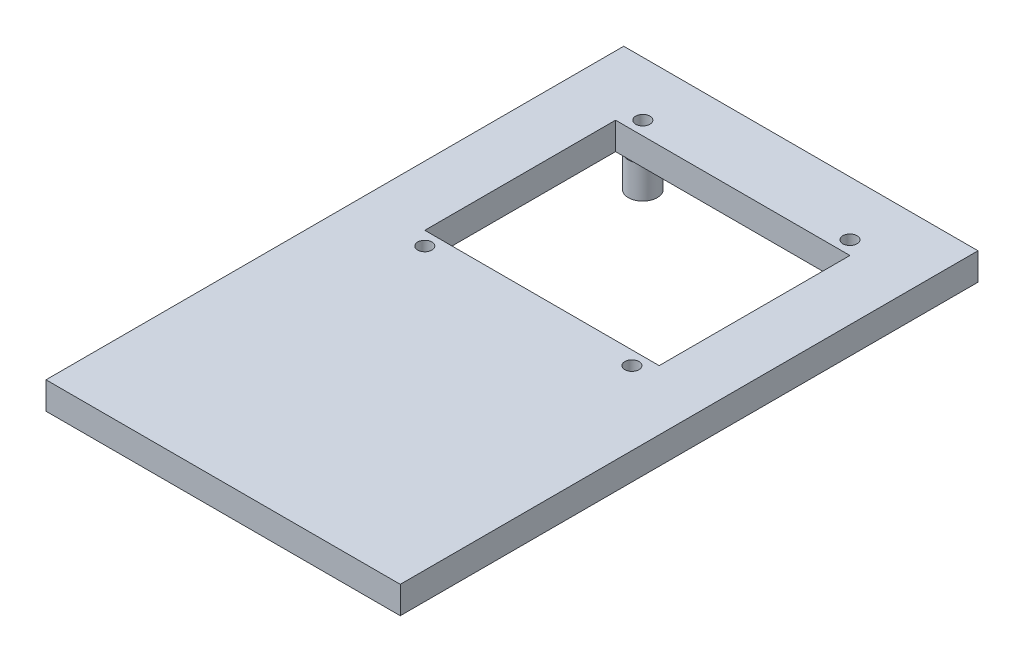
ISO-10303-21;
HEADER;
FILE_DESCRIPTION(('STEP AP214'),'2;1');
FILE_NAME('part.step','',(''),(''),'','','');
FILE_SCHEMA(('AUTOMOTIVE_DESIGN { 1 0 10303 214 1 1 1 1 }'));
ENDSEC;
DATA;
#1=APPLICATION_CONTEXT('core data for automotive mechanical design processes');
#2=APPLICATION_PROTOCOL_DEFINITION('international standard','automotive_design',2000,#1);
#3=PRODUCT_CONTEXT('',#1,'mechanical');
#4=PRODUCT('Part','Part','',(#3));
#5=PRODUCT_RELATED_PRODUCT_CATEGORY('part','',(#4));
#6=PRODUCT_DEFINITION_FORMATION('','',#4);
#7=PRODUCT_DEFINITION_CONTEXT('part definition',#1,'design');
#8=PRODUCT_DEFINITION('design','',#6,#7);
#9=PRODUCT_DEFINITION_SHAPE('','',#8);
#10=(LENGTH_UNIT() NAMED_UNIT(*) SI_UNIT(.MILLI.,.METRE.));
#11=(NAMED_UNIT(*) PLANE_ANGLE_UNIT() SI_UNIT($,.RADIAN.));
#12=(NAMED_UNIT(*) SI_UNIT($,.STERADIAN.) SOLID_ANGLE_UNIT());
#13=UNCERTAINTY_MEASURE_WITH_UNIT(LENGTH_MEASURE(1.E-05),#10,'distance_accuracy_value','');
#14=(GEOMETRIC_REPRESENTATION_CONTEXT(3) GLOBAL_UNCERTAINTY_ASSIGNED_CONTEXT((#13)) GLOBAL_UNIT_ASSIGNED_CONTEXT((#10,
#11,#12)) REPRESENTATION_CONTEXT('',''));
#15=CARTESIAN_POINT('',(0.,0.,0.));
#16=DIRECTION('',(0.,0.,1.));
#17=DIRECTION('',(1.,0.,0.));
#18=AXIS2_PLACEMENT_3D('',#15,#16,#17);
#19=CARTESIAN_POINT('',(-47.,5.,-30.));
#20=DIRECTION('',(0.,0.,-1.));
#21=DIRECTION('',(-1.,0.,0.));
#22=AXIS2_PLACEMENT_3D('',#19,#20,#21);
#23=PLANE('',#22);
#24=DIRECTION('',(1.,0.,0.));
#25=VECTOR('',#24,1.);
#26=CARTESIAN_POINT('',(-47.,0.,-30.));
#27=LINE('',#26,#25);
#28=CARTESIAN_POINT('',(-47.,0.,-30.));
#29=VERTEX_POINT('',#28);
#30=CARTESIAN_POINT('',(18.,0.,-30.));
#31=VERTEX_POINT('',#30);
#32=EDGE_CURVE('E275',#29,#31,#27,.T.);
#33=ORIENTED_EDGE('',*,*,#32,.F.);
#34=DIRECTION('',(0.,-1.,0.));
#35=VECTOR('',#34,1.);
#36=CARTESIAN_POINT('',(-47.,5.,-30.));
#37=LINE('',#36,#35);
#38=CARTESIAN_POINT('',(-47.,5.,-30.));
#39=VERTEX_POINT('',#38);
#40=EDGE_CURVE('E11',#39,#29,#37,.T.);
#41=ORIENTED_EDGE('',*,*,#40,.F.);
#42=DIRECTION('',(1.,0.,0.));
#43=VECTOR('',#42,1.);
#44=CARTESIAN_POINT('',(-47.,5.,-30.));
#45=LINE('',#44,#43);
#46=CARTESIAN_POINT('',(18.,5.,-30.));
#47=VERTEX_POINT('',#46);
#48=EDGE_CURVE('E138',#39,#47,#45,.T.);
#49=ORIENTED_EDGE('',*,*,#48,.T.);
#50=DIRECTION('',(0.,-1.,0.));
#51=VECTOR('',#50,1.);
#52=CARTESIAN_POINT('',(18.,5.,-30.));
#53=LINE('',#52,#51);
#54=EDGE_CURVE('E44',#47,#31,#53,.T.);
#55=ORIENTED_EDGE('',*,*,#54,.T.);
#56=EDGE_LOOP('',(#33,#41,#49,#55));
#57=FACE_BOUND('',#56,.T.);
#58=ADVANCED_FACE('F41',(#57),#23,.T.);
#59=CARTESIAN_POINT('',(-47.,5.,-30.));
#60=DIRECTION('',(1.,0.,0.));
#61=DIRECTION('',(0.,0.,-1.));
#62=AXIS2_PLACEMENT_3D('',#59,#60,#61);
#63=PLANE('',#62);
#64=DIRECTION('',(0.,0.,1.));
#65=VECTOR('',#64,1.);
#66=CARTESIAN_POINT('',(-47.,0.,-30.));
#67=LINE('',#66,#65);
#68=CARTESIAN_POINT('',(-47.,0.,76.));
#69=VERTEX_POINT('',#68);
#70=EDGE_CURVE('E129',#29,#69,#67,.T.);
#71=ORIENTED_EDGE('',*,*,#70,.T.);
#72=DIRECTION('',(0.,-1.,0.));
#73=VECTOR('',#72,1.);
#74=CARTESIAN_POINT('',(-47.,5.,76.));
#75=LINE('',#74,#73);
#76=CARTESIAN_POINT('',(-47.,5.,76.));
#77=VERTEX_POINT('',#76);
#78=EDGE_CURVE('E134',#77,#69,#75,.T.);
#79=ORIENTED_EDGE('',*,*,#78,.F.);
#80=DIRECTION('',(0.,0.,1.));
#81=VECTOR('',#80,1.);
#82=CARTESIAN_POINT('',(-47.,5.,-30.));
#83=LINE('',#82,#81);
#84=EDGE_CURVE('E280',#39,#77,#83,.T.);
#85=ORIENTED_EDGE('',*,*,#84,.F.);
#86=ORIENTED_EDGE('',*,*,#40,.T.);
#87=EDGE_LOOP('',(#71,#79,#85,#86));
#88=FACE_BOUND('',#87,.T.);
#89=ADVANCED_FACE('F131',(#88),#63,.F.);
#90=CARTESIAN_POINT('',(18.,5.,-30.));
#91=DIRECTION('',(1.,0.,0.));
#92=DIRECTION('',(0.,0.,-1.));
#93=AXIS2_PLACEMENT_3D('',#90,#91,#92);
#94=PLANE('',#93);
#95=DIRECTION('',(0.,0.,1.));
#96=VECTOR('',#95,1.);
#97=CARTESIAN_POINT('',(18.,0.,-30.));
#98=LINE('',#97,#96);
#99=CARTESIAN_POINT('',(18.,0.,76.));
#100=VERTEX_POINT('',#99);
#101=EDGE_CURVE('E139',#31,#100,#98,.T.);
#102=ORIENTED_EDGE('',*,*,#101,.F.);
#103=ORIENTED_EDGE('',*,*,#54,.F.);
#104=DIRECTION('',(0.,0.,1.));
#105=VECTOR('',#104,1.);
#106=CARTESIAN_POINT('',(18.,5.,-30.));
#107=LINE('',#106,#105);
#108=CARTESIAN_POINT('',(18.,5.,76.));
#109=VERTEX_POINT('',#108);
#110=EDGE_CURVE('E278',#47,#109,#107,.T.);
#111=ORIENTED_EDGE('',*,*,#110,.T.);
#112=DIRECTION('',(0.,1.,0.));
#113=VECTOR('',#112,1.);
#114=CARTESIAN_POINT('',(18.,0.,76.));
#115=LINE('',#114,#113);
#116=EDGE_CURVE('E148',#100,#109,#115,.T.);
#117=ORIENTED_EDGE('',*,*,#116,.F.);
#118=EDGE_LOOP('',(#102,#103,#111,#117));
#119=FACE_BOUND('',#118,.T.);
#120=ADVANCED_FACE('F287',(#119),#94,.T.);
#121=CARTESIAN_POINT('',(0.,5.,0.));
#122=DIRECTION('',(0.,-1.,0.));
#123=DIRECTION('',(0.,0.,-1.));
#124=AXIS2_PLACEMENT_3D('',#121,#122,#123);
#125=PLANE('',#124);
#126=CARTESIAN_POINT('',(-33.5,5.,20.));
#127=DIRECTION('',(0.,1.,0.));
#128=DIRECTION('',(0.,0.,1.));
#129=AXIS2_PLACEMENT_3D('',#126,#127,#128);
#130=CIRCLE('',#129,1.29999999999999);
#131=CARTESIAN_POINT('',(-33.5,5.,21.3));
#132=VERTEX_POINT('',#131);
#133=EDGE_CURVE('E209',#132,#132,#130,.T.);
#134=ORIENTED_EDGE('',*,*,#133,.F.);
#135=EDGE_LOOP('',(#134));
#136=FACE_BOUND('',#135,.T.);
#137=CARTESIAN_POINT('',(4.50000000000001,5.,20.));
#138=DIRECTION('',(0.,1.,0.));
#139=DIRECTION('',(0.,0.,1.));
#140=AXIS2_PLACEMENT_3D('',#137,#138,#139);
#141=CIRCLE('',#140,1.3);
#142=CARTESIAN_POINT('',(4.50000000000001,5.,21.3));
#143=VERTEX_POINT('',#142);
#144=EDGE_CURVE('E223',#143,#143,#141,.T.);
#145=ORIENTED_EDGE('',*,*,#144,.F.);
#146=EDGE_LOOP('',(#145));
#147=FACE_BOUND('',#146,.T.);
#148=CARTESIAN_POINT('',(4.49999999999999,5.,-20.));
#149=DIRECTION('',(0.,1.,0.));
#150=DIRECTION('',(0.,0.,1.));
#151=AXIS2_PLACEMENT_3D('',#148,#149,#150);
#152=CIRCLE('',#151,1.3);
#153=CARTESIAN_POINT('',(4.49999999999999,5.,-18.7));
#154=VERTEX_POINT('',#153);
#155=EDGE_CURVE('E217',#154,#154,#152,.T.);
#156=ORIENTED_EDGE('',*,*,#155,.F.);
#157=EDGE_LOOP('',(#156));
#158=FACE_BOUND('',#157,.T.);
#159=CARTESIAN_POINT('',(-33.5,5.,-20.));
#160=DIRECTION('',(0.,1.,0.));
#161=DIRECTION('',(0.,0.,1.));
#162=AXIS2_PLACEMENT_3D('',#159,#160,#161);
#163=CIRCLE('',#162,1.29999999999999);
#164=CARTESIAN_POINT('',(-33.5,5.,-18.7));
#165=VERTEX_POINT('',#164);
#166=EDGE_CURVE('E231',#165,#165,#163,.T.);
#167=ORIENTED_EDGE('',*,*,#166,.F.);
#168=EDGE_LOOP('',(#167));
#169=FACE_BOUND('',#168,.T.);
#170=DIRECTION('',(-1.,0.,0.));
#171=VECTOR('',#170,1.);
#172=CARTESIAN_POINT('',(0.,5.,17.5));
#173=LINE('',#172,#171);
#174=CARTESIAN_POINT('',(7.00000000000001,5.,17.5));
#175=VERTEX_POINT('',#174);
#176=CARTESIAN_POINT('',(-36.,5.,17.5));
#177=VERTEX_POINT('',#176);
#178=EDGE_CURVE('E269',#175,#177,#173,.T.);
#179=ORIENTED_EDGE('',*,*,#178,.T.);
#180=DIRECTION('',(0.,0.,-1.));
#181=VECTOR('',#180,1.);
#182=CARTESIAN_POINT('',(-36.,5.,0.));
#183=LINE('',#182,#181);
#184=CARTESIAN_POINT('',(-36.,5.,-17.5));
#185=VERTEX_POINT('',#184);
#186=EDGE_CURVE('E272',#177,#185,#183,.T.);
#187=ORIENTED_EDGE('',*,*,#186,.T.);
#188=DIRECTION('',(1.,0.,0.));
#189=VECTOR('',#188,1.);
#190=CARTESIAN_POINT('',(0.,5.,-17.5));
#191=LINE('',#190,#189);
#192=CARTESIAN_POINT('',(7.00000000000001,5.,-17.5));
#193=VERTEX_POINT('',#192);
#194=EDGE_CURVE('E256',#185,#193,#191,.T.);
#195=ORIENTED_EDGE('',*,*,#194,.T.);
#196=DIRECTION('',(0.,0.,1.));
#197=VECTOR('',#196,1.);
#198=CARTESIAN_POINT('',(7.00000000000001,5.,0.));
#199=LINE('',#198,#197);
#200=EDGE_CURVE('E266',#193,#175,#199,.T.);
#201=ORIENTED_EDGE('',*,*,#200,.T.);
#202=EDGE_LOOP('',(#179,#187,#195,#201));
#203=FACE_BOUND('',#202,.T.);
#204=ORIENTED_EDGE('',*,*,#48,.F.);
#205=ORIENTED_EDGE('',*,*,#84,.T.);
#206=DIRECTION('',(-1.,0.,0.));
#207=VECTOR('',#206,1.);
#208=CARTESIAN_POINT('',(18.,5.,76.));
#209=LINE('',#208,#207);
#210=EDGE_CURVE('E153',#109,#77,#209,.T.);
#211=ORIENTED_EDGE('',*,*,#210,.F.);
#212=ORIENTED_EDGE('',*,*,#110,.F.);
#213=EDGE_LOOP('',(#204,#205,#211,#212));
#214=FACE_BOUND('',#213,.T.);
#215=ADVANCED_FACE('F289',(#136,#147,#158,#169,#203,#214),#125,.F.);
#216=CARTESIAN_POINT('',(0.,0.,0.));
#217=DIRECTION('',(0.,-1.,0.));
#218=DIRECTION('',(0.,0.,-1.));
#219=AXIS2_PLACEMENT_3D('',#216,#217,#218);
#220=PLANE('',#219);
#221=DIRECTION('',(1.,0.,0.));
#222=VECTOR('',#221,1.);
#223=CARTESIAN_POINT('',(-36.,0.,-17.5));
#224=LINE('',#223,#222);
#225=CARTESIAN_POINT('',(5.3789197915623,0.,-17.5));
#226=VERTEX_POINT('',#225);
#227=CARTESIAN_POINT('',(7.00000000000001,0.,-17.5));
#228=VERTEX_POINT('',#227);
#229=EDGE_CURVE('E238',#226,#228,#224,.T.);
#230=ORIENTED_EDGE('',*,*,#229,.F.);
#231=CARTESIAN_POINT('',(4.49999999999999,0.,-20.));
#232=DIRECTION('',(0.,-1.,0.));
#233=DIRECTION('',(0.,0.,-1.));
#234=AXIS2_PLACEMENT_3D('',#231,#232,#233);
#235=CIRCLE('',#234,2.65);
#236=CARTESIAN_POINT('',(3.62108020843768,0.,-17.5));
#237=VERTEX_POINT('',#236);
#238=EDGE_CURVE('E161',#237,#226,#235,.T.);
#239=ORIENTED_EDGE('',*,*,#238,.F.);
#240=CARTESIAN_POINT('',(-32.6210802084376,0.,-17.5));
#241=VERTEX_POINT('',#240);
#242=EDGE_CURVE('E243',#241,#237,#224,.T.);
#243=ORIENTED_EDGE('',*,*,#242,.F.);
#244=CARTESIAN_POINT('',(-33.5,0.,-20.));
#245=DIRECTION('',(0.,-1.,0.));
#246=DIRECTION('',(0.,0.,-1.));
#247=AXIS2_PLACEMENT_3D('',#244,#245,#246);
#248=CIRCLE('',#247,2.65000000000001);
#249=CARTESIAN_POINT('',(-34.3789197915624,0.,-17.5));
#250=VERTEX_POINT('',#249);
#251=EDGE_CURVE('E189',#250,#241,#248,.T.);
#252=ORIENTED_EDGE('',*,*,#251,.F.);
#253=CARTESIAN_POINT('',(-36.,0.,-17.5));
#254=VERTEX_POINT('',#253);
#255=EDGE_CURVE('E239',#254,#250,#224,.T.);
#256=ORIENTED_EDGE('',*,*,#255,.F.);
#257=DIRECTION('',(0.,0.,-1.));
#258=VECTOR('',#257,1.);
#259=CARTESIAN_POINT('',(-36.,0.,17.5));
#260=LINE('',#259,#258);
#261=CARTESIAN_POINT('',(-36.,0.,17.5));
#262=VERTEX_POINT('',#261);
#263=EDGE_CURVE('E234',#262,#254,#260,.T.);
#264=ORIENTED_EDGE('',*,*,#263,.F.);
#265=DIRECTION('',(-1.,0.,0.));
#266=VECTOR('',#265,1.);
#267=CARTESIAN_POINT('',(-36.,0.,17.5));
#268=LINE('',#267,#266);
#269=CARTESIAN_POINT('',(-34.3789197915623,0.,17.5));
#270=VERTEX_POINT('',#269);
#271=EDGE_CURVE('E246',#270,#262,#268,.T.);
#272=ORIENTED_EDGE('',*,*,#271,.F.);
#273=CARTESIAN_POINT('',(-33.5,0.,20.));
#274=DIRECTION('',(0.,-1.,0.));
#275=DIRECTION('',(0.,0.,-1.));
#276=AXIS2_PLACEMENT_3D('',#273,#274,#275);
#277=CIRCLE('',#276,2.65);
#278=CARTESIAN_POINT('',(-32.6210802084377,0.,17.5));
#279=VERTEX_POINT('',#278);
#280=EDGE_CURVE('E210',#279,#270,#277,.T.);
#281=ORIENTED_EDGE('',*,*,#280,.F.);
#282=CARTESIAN_POINT('',(3.62108020843765,0.,17.5));
#283=VERTEX_POINT('',#282);
#284=EDGE_CURVE('E251',#283,#279,#268,.T.);
#285=ORIENTED_EDGE('',*,*,#284,.F.);
#286=CARTESIAN_POINT('',(4.50000000000001,0.,20.));
#287=DIRECTION('',(0.,-1.,0.));
#288=DIRECTION('',(0.,0.,-1.));
#289=AXIS2_PLACEMENT_3D('',#286,#287,#288);
#290=CIRCLE('',#289,2.65);
#291=CARTESIAN_POINT('',(5.37891979156238,0.,17.5));
#292=VERTEX_POINT('',#291);
#293=EDGE_CURVE('E61',#292,#283,#290,.T.);
#294=ORIENTED_EDGE('',*,*,#293,.F.);
#295=CARTESIAN_POINT('',(7.00000000000001,0.,17.5));
#296=VERTEX_POINT('',#295);
#297=EDGE_CURVE('E247',#296,#292,#268,.T.);
#298=ORIENTED_EDGE('',*,*,#297,.F.);
#299=DIRECTION('',(0.,0.,1.));
#300=VECTOR('',#299,1.);
#301=CARTESIAN_POINT('',(7.00000000000001,0.,17.5));
#302=LINE('',#301,#300);
#303=EDGE_CURVE('E242',#228,#296,#302,.T.);
#304=ORIENTED_EDGE('',*,*,#303,.F.);
#305=EDGE_LOOP('',(#230,#239,#243,#252,#256,#264,#272,#281,#285,#294,#298,#304));
#306=FACE_BOUND('',#305,.T.);
#307=ORIENTED_EDGE('',*,*,#32,.T.);
#308=ORIENTED_EDGE('',*,*,#101,.T.);
#309=DIRECTION('',(1.,0.,0.));
#310=VECTOR('',#309,1.);
#311=CARTESIAN_POINT('',(-47.,0.,76.));
#312=LINE('',#311,#310);
#313=EDGE_CURVE('E142',#69,#100,#312,.T.);
#314=ORIENTED_EDGE('',*,*,#313,.F.);
#315=ORIENTED_EDGE('',*,*,#70,.F.);
#316=EDGE_LOOP('',(#307,#308,#314,#315));
#317=FACE_BOUND('',#316,.T.);
#318=ADVANCED_FACE('F143',(#306,#317),#220,.T.);
#319=CARTESIAN_POINT('',(-36.,10.,17.5));
#320=DIRECTION('',(-1.,0.,0.));
#321=DIRECTION('',(0.,0.,1.));
#322=AXIS2_PLACEMENT_3D('',#319,#320,#321);
#323=PLANE('',#322);
#324=DIRECTION('',(0.,-1.,0.));
#325=VECTOR('',#324,1.);
#326=CARTESIAN_POINT('',(-36.,10.,17.5));
#327=LINE('',#326,#325);
#328=EDGE_CURVE('E253',#177,#262,#327,.T.);
#329=ORIENTED_EDGE('',*,*,#328,.T.);
#330=ORIENTED_EDGE('',*,*,#263,.T.);
#331=DIRECTION('',(0.,-1.,0.));
#332=VECTOR('',#331,1.);
#333=CARTESIAN_POINT('',(-36.,10.,-17.5));
#334=LINE('',#333,#332);
#335=EDGE_CURVE('E250',#185,#254,#334,.T.);
#336=ORIENTED_EDGE('',*,*,#335,.F.);
#337=ORIENTED_EDGE('',*,*,#186,.F.);
#338=EDGE_LOOP('',(#329,#330,#336,#337));
#339=FACE_BOUND('',#338,.T.);
#340=ADVANCED_FACE('F297',(#339),#323,.F.);
#341=CARTESIAN_POINT('',(-36.,10.,17.5));
#342=DIRECTION('',(0.,0.,1.));
#343=DIRECTION('',(1.,0.,0.));
#344=AXIS2_PLACEMENT_3D('',#341,#342,#343);
#345=PLANE('',#344);
#346=DIRECTION('',(0.,-1.,0.));
#347=VECTOR('',#346,1.);
#348=CARTESIAN_POINT('',(7.00000000000001,10.,17.5));
#349=LINE('',#348,#347);
#350=EDGE_CURVE('E257',#175,#296,#349,.T.);
#351=ORIENTED_EDGE('',*,*,#350,.T.);
#352=ORIENTED_EDGE('',*,*,#297,.T.);
#353=DIRECTION('',(1.,0.,0.));
#354=VECTOR('',#353,1.);
#355=CARTESIAN_POINT('',(-36.,0.,17.5));
#356=LINE('',#355,#354);
#357=EDGE_CURVE('E180',#283,#292,#356,.T.);
#358=ORIENTED_EDGE('',*,*,#357,.F.);
#359=ORIENTED_EDGE('',*,*,#284,.T.);
#360=EDGE_CURVE('E252',#279,#270,#268,.T.);
#361=ORIENTED_EDGE('',*,*,#360,.T.);
#362=ORIENTED_EDGE('',*,*,#271,.T.);
#363=ORIENTED_EDGE('',*,*,#328,.F.);
#364=ORIENTED_EDGE('',*,*,#178,.F.);
#365=EDGE_LOOP('',(#351,#352,#358,#359,#361,#362,#363,#364));
#366=FACE_BOUND('',#365,.T.);
#367=ADVANCED_FACE('F572',(#366),#345,.F.);
#368=CARTESIAN_POINT('',(7.00000000000001,10.,17.5));
#369=DIRECTION('',(1.,0.,0.));
#370=DIRECTION('',(0.,0.,-1.));
#371=AXIS2_PLACEMENT_3D('',#368,#369,#370);
#372=PLANE('',#371);
#373=DIRECTION('',(0.,-1.,0.));
#374=VECTOR('',#373,1.);
#375=CARTESIAN_POINT('',(7.00000000000001,10.,-17.5));
#376=LINE('',#375,#374);
#377=EDGE_CURVE('E259',#193,#228,#376,.T.);
#378=ORIENTED_EDGE('',*,*,#377,.T.);
#379=ORIENTED_EDGE('',*,*,#303,.T.);
#380=ORIENTED_EDGE('',*,*,#350,.F.);
#381=ORIENTED_EDGE('',*,*,#200,.F.);
#382=EDGE_LOOP('',(#378,#379,#380,#381));
#383=FACE_BOUND('',#382,.T.);
#384=ADVANCED_FACE('F563',(#383),#372,.F.);
#385=CARTESIAN_POINT('',(-36.,10.,-17.5));
#386=DIRECTION('',(0.,0.,-1.));
#387=DIRECTION('',(-1.,0.,0.));
#388=AXIS2_PLACEMENT_3D('',#385,#386,#387);
#389=PLANE('',#388);
#390=ORIENTED_EDGE('',*,*,#335,.T.);
#391=ORIENTED_EDGE('',*,*,#255,.T.);
#392=DIRECTION('',(-1.,0.,0.));
#393=VECTOR('',#392,1.);
#394=CARTESIAN_POINT('',(-36.,0.,-17.5));
#395=LINE('',#394,#393);
#396=EDGE_CURVE('E195',#241,#250,#395,.T.);
#397=ORIENTED_EDGE('',*,*,#396,.F.);
#398=ORIENTED_EDGE('',*,*,#242,.T.);
#399=DIRECTION('',(-1.,0.,0.));
#400=VECTOR('',#399,1.);
#401=CARTESIAN_POINT('',(-36.,0.,-17.5));
#402=LINE('',#401,#400);
#403=EDGE_CURVE('E167',#226,#237,#402,.T.);
#404=ORIENTED_EDGE('',*,*,#403,.F.);
#405=ORIENTED_EDGE('',*,*,#229,.T.);
#406=ORIENTED_EDGE('',*,*,#377,.F.);
#407=ORIENTED_EDGE('',*,*,#194,.F.);
#408=EDGE_LOOP('',(#390,#391,#397,#398,#404,#405,#406,#407));
#409=FACE_BOUND('',#408,.T.);
#410=ADVANCED_FACE('F554',(#409),#389,.F.);
#411=CARTESIAN_POINT('',(-33.5,-0.00100000000000013,-20.));
#412=DIRECTION('',(0.,1.,0.));
#413=DIRECTION('',(0.,0.,1.));
#414=AXIS2_PLACEMENT_3D('',#411,#412,#413);
#415=CYLINDRICAL_SURFACE('',#414,1.29999999999999);
#416=CARTESIAN_POINT('',(-33.5,0.,-20.));
#417=DIRECTION('',(0.,-1.,0.));
#418=DIRECTION('',(0.,0.,-1.));
#419=AXIS2_PLACEMENT_3D('',#416,#417,#418);
#420=CIRCLE('',#419,1.29999999999999);
#421=CARTESIAN_POINT('',(-33.5,0.,-21.3));
#422=VERTEX_POINT('',#421);
#423=EDGE_CURVE('E216',#422,#422,#420,.F.);
#424=ORIENTED_EDGE('',*,*,#423,.F.);
#425=EDGE_LOOP('',(#424));
#426=FACE_BOUND('',#425,.T.);
#427=ORIENTED_EDGE('',*,*,#166,.T.);
#428=EDGE_LOOP('',(#427));
#429=FACE_BOUND('',#428,.T.);
#430=ADVANCED_FACE('F545',(#426,#429),#415,.F.);
#431=CARTESIAN_POINT('',(4.49999999999999,-0.00100000000000013,-20.));
#432=DIRECTION('',(0.,1.,0.));
#433=DIRECTION('',(0.,0.,1.));
#434=AXIS2_PLACEMENT_3D('',#431,#432,#433);
#435=CYLINDRICAL_SURFACE('',#434,1.3);
#436=CARTESIAN_POINT('',(4.49999999999999,0.,-20.));
#437=DIRECTION('',(0.,-1.,0.));
#438=DIRECTION('',(0.,0.,-1.));
#439=AXIS2_PLACEMENT_3D('',#436,#437,#438);
#440=CIRCLE('',#439,1.3);
#441=CARTESIAN_POINT('',(4.49999999999999,0.,-21.3));
#442=VERTEX_POINT('',#441);
#443=EDGE_CURVE('E213',#442,#442,#440,.F.);
#444=ORIENTED_EDGE('',*,*,#443,.F.);
#445=EDGE_LOOP('',(#444));
#446=FACE_BOUND('',#445,.T.);
#447=ORIENTED_EDGE('',*,*,#155,.T.);
#448=EDGE_LOOP('',(#447));
#449=FACE_BOUND('',#448,.T.);
#450=ADVANCED_FACE('F536',(#446,#449),#435,.F.);
#451=CARTESIAN_POINT('',(4.50000000000001,-0.00100000000000013,20.));
#452=DIRECTION('',(0.,1.,0.));
#453=DIRECTION('',(0.,0.,1.));
#454=AXIS2_PLACEMENT_3D('',#451,#452,#453);
#455=CYLINDRICAL_SURFACE('',#454,1.3);
#456=CARTESIAN_POINT('',(4.50000000000001,0.,20.));
#457=DIRECTION('',(0.,-1.,0.));
#458=DIRECTION('',(0.,0.,-1.));
#459=AXIS2_PLACEMENT_3D('',#456,#457,#458);
#460=CIRCLE('',#459,1.3);
#461=CARTESIAN_POINT('',(4.50000000000001,0.,18.7));
#462=VERTEX_POINT('',#461);
#463=EDGE_CURVE('E220',#462,#462,#460,.F.);
#464=ORIENTED_EDGE('',*,*,#463,.F.);
#465=EDGE_LOOP('',(#464));
#466=FACE_BOUND('',#465,.T.);
#467=ORIENTED_EDGE('',*,*,#144,.T.);
#468=EDGE_LOOP('',(#467));
#469=FACE_BOUND('',#468,.T.);
#470=ADVANCED_FACE('F527',(#466,#469),#455,.F.);
#471=CARTESIAN_POINT('',(-33.5,-0.00100000000000013,20.));
#472=DIRECTION('',(0.,1.,0.));
#473=DIRECTION('',(0.,0.,1.));
#474=AXIS2_PLACEMENT_3D('',#471,#472,#473);
#475=CYLINDRICAL_SURFACE('',#474,1.29999999999999);
#476=CARTESIAN_POINT('',(-33.5,0.,20.));
#477=DIRECTION('',(0.,-1.,0.));
#478=DIRECTION('',(0.,0.,-1.));
#479=AXIS2_PLACEMENT_3D('',#476,#477,#478);
#480=CIRCLE('',#479,1.29999999999999);
#481=CARTESIAN_POINT('',(-33.5,0.,18.7));
#482=VERTEX_POINT('',#481);
#483=EDGE_CURVE('E226',#482,#482,#480,.F.);
#484=ORIENTED_EDGE('',*,*,#483,.F.);
#485=EDGE_LOOP('',(#484));
#486=FACE_BOUND('',#485,.T.);
#487=ORIENTED_EDGE('',*,*,#133,.T.);
#488=EDGE_LOOP('',(#487));
#489=FACE_BOUND('',#488,.T.);
#490=ADVANCED_FACE('F519',(#486,#489),#475,.F.);
#491=CARTESIAN_POINT('',(-33.5,0.,20.));
#492=DIRECTION('',(0.,-1.,0.));
#493=DIRECTION('',(0.,0.,-1.));
#494=AXIS2_PLACEMENT_3D('',#491,#492,#493);
#495=PLANE('',#494);
#496=CARTESIAN_POINT('',(-33.5,0.,20.));
#497=DIRECTION('',(0.,-1.,0.));
#498=DIRECTION('',(0.,0.,-1.));
#499=AXIS2_PLACEMENT_3D('',#496,#497,#498);
#500=CIRCLE('',#499,1.04999999999999);
#501=CARTESIAN_POINT('',(-33.5,0.,18.95));
#502=VERTEX_POINT('',#501);
#503=EDGE_CURVE('E199',#502,#502,#500,.T.);
#504=ORIENTED_EDGE('',*,*,#503,.T.);
#505=EDGE_LOOP('',(#504));
#506=FACE_BOUND('',#505,.T.);
#507=ORIENTED_EDGE('',*,*,#483,.T.);
#508=EDGE_LOOP('',(#507));
#509=FACE_BOUND('',#508,.T.);
#510=ADVANCED_FACE('F504',(#506,#509),#495,.F.);
#511=CARTESIAN_POINT('',(-33.5,-6.,20.));
#512=DIRECTION('',(0.,-1.,0.));
#513=DIRECTION('',(0.,0.,-1.));
#514=AXIS2_PLACEMENT_3D('',#511,#512,#513);
#515=PLANE('',#514);
#516=CARTESIAN_POINT('',(-33.5,-6.,20.));
#517=DIRECTION('',(0.,-1.,0.));
#518=DIRECTION('',(0.,0.,-1.));
#519=AXIS2_PLACEMENT_3D('',#516,#517,#518);
#520=CIRCLE('',#519,2.65);
#521=CARTESIAN_POINT('',(-33.5,-6.,17.35));
#522=VERTEX_POINT('',#521);
#523=EDGE_CURVE('E206',#522,#522,#520,.T.);
#524=ORIENTED_EDGE('',*,*,#523,.T.);
#525=EDGE_LOOP('',(#524));
#526=FACE_BOUND('',#525,.T.);
#527=CARTESIAN_POINT('',(-33.5,-6.,20.));
#528=DIRECTION('',(0.,-1.,0.));
#529=DIRECTION('',(0.,0.,-1.));
#530=AXIS2_PLACEMENT_3D('',#527,#528,#529);
#531=CIRCLE('',#530,1.04999999999999);
#532=CARTESIAN_POINT('',(-33.5,-6.,18.95));
#533=VERTEX_POINT('',#532);
#534=EDGE_CURVE('E200',#533,#533,#531,.T.);
#535=ORIENTED_EDGE('',*,*,#534,.F.);
#536=EDGE_LOOP('',(#535));
#537=FACE_BOUND('',#536,.T.);
#538=ADVANCED_FACE('F501',(#526,#537),#515,.T.);
#539=ORIENTED_EDGE('',*,*,#360,.F.);
#540=EDGE_CURVE('E203',#270,#279,#277,.T.);
#541=ORIENTED_EDGE('',*,*,#540,.F.);
#542=EDGE_LOOP('',(#539,#541));
#543=FACE_BOUND('',#542,.T.);
#544=ADVANCED_FACE('F492',(#543),#495,.F.);
#545=CARTESIAN_POINT('',(-33.5,-6.,20.));
#546=DIRECTION('',(0.,1.,0.));
#547=DIRECTION('',(0.,0.,1.));
#548=AXIS2_PLACEMENT_3D('',#545,#546,#547);
#549=CYLINDRICAL_SURFACE('',#548,2.65);
#550=ORIENTED_EDGE('',*,*,#523,.F.);
#551=EDGE_LOOP('',(#550));
#552=FACE_BOUND('',#551,.T.);
#553=ORIENTED_EDGE('',*,*,#280,.T.);
#554=ORIENTED_EDGE('',*,*,#540,.T.);
#555=EDGE_LOOP('',(#553,#554));
#556=FACE_BOUND('',#555,.T.);
#557=ADVANCED_FACE('F483',(#552,#556),#549,.T.);
#558=CARTESIAN_POINT('',(-33.5,-6.,20.));
#559=DIRECTION('',(0.,1.,0.));
#560=DIRECTION('',(0.,0.,1.));
#561=AXIS2_PLACEMENT_3D('',#558,#559,#560);
#562=CYLINDRICAL_SURFACE('',#561,1.04999999999999);
#563=ORIENTED_EDGE('',*,*,#534,.T.);
#564=EDGE_LOOP('',(#563));
#565=FACE_BOUND('',#564,.T.);
#566=ORIENTED_EDGE('',*,*,#503,.F.);
#567=EDGE_LOOP('',(#566));
#568=FACE_BOUND('',#567,.T.);
#569=ADVANCED_FACE('F475',(#565,#568),#562,.F.);
#570=CARTESIAN_POINT('',(-33.5,0.,-20.));
#571=DIRECTION('',(0.,-1.,0.));
#572=DIRECTION('',(0.,0.,-1.));
#573=AXIS2_PLACEMENT_3D('',#570,#571,#572);
#574=PLANE('',#573);
#575=EDGE_CURVE('E185',#241,#250,#248,.T.);
#576=ORIENTED_EDGE('',*,*,#575,.F.);
#577=ORIENTED_EDGE('',*,*,#396,.T.);
#578=EDGE_LOOP('',(#576,#577));
#579=FACE_BOUND('',#578,.T.);
#580=ADVANCED_FACE('F466',(#579),#574,.F.);
#581=CARTESIAN_POINT('',(-33.5,0.,-20.));
#582=DIRECTION('',(0.,-1.,0.));
#583=DIRECTION('',(0.,0.,-1.));
#584=AXIS2_PLACEMENT_3D('',#581,#582,#583);
#585=CIRCLE('',#584,1.05);
#586=CARTESIAN_POINT('',(-33.5,0.,-21.05));
#587=VERTEX_POINT('',#586);
#588=EDGE_CURVE('E192',#587,#587,#585,.T.);
#589=ORIENTED_EDGE('',*,*,#588,.T.);
#590=EDGE_LOOP('',(#589));
#591=FACE_BOUND('',#590,.T.);
#592=ORIENTED_EDGE('',*,*,#423,.T.);
#593=EDGE_LOOP('',(#592));
#594=FACE_BOUND('',#593,.T.);
#595=ADVANCED_FACE('F457',(#591,#594),#574,.F.);
#596=CARTESIAN_POINT('',(-33.5,-6.,-20.));
#597=DIRECTION('',(0.,-1.,0.));
#598=DIRECTION('',(0.,0.,-1.));
#599=AXIS2_PLACEMENT_3D('',#596,#597,#598);
#600=PLANE('',#599);
#601=CARTESIAN_POINT('',(-33.5,-6.,-20.));
#602=DIRECTION('',(0.,-1.,0.));
#603=DIRECTION('',(0.,0.,-1.));
#604=AXIS2_PLACEMENT_3D('',#601,#602,#603);
#605=CIRCLE('',#604,2.65000000000001);
#606=CARTESIAN_POINT('',(-33.5,-6.,-22.65));
#607=VERTEX_POINT('',#606);
#608=EDGE_CURVE('E184',#607,#607,#605,.T.);
#609=ORIENTED_EDGE('',*,*,#608,.T.);
#610=EDGE_LOOP('',(#609));
#611=FACE_BOUND('',#610,.T.);
#612=CARTESIAN_POINT('',(-33.5,-6.,-20.));
#613=DIRECTION('',(0.,-1.,0.));
#614=DIRECTION('',(0.,0.,-1.));
#615=AXIS2_PLACEMENT_3D('',#612,#613,#614);
#616=CIRCLE('',#615,1.05);
#617=CARTESIAN_POINT('',(-33.5,-6.,-21.05));
#618=VERTEX_POINT('',#617);
#619=EDGE_CURVE('E188',#618,#618,#616,.T.);
#620=ORIENTED_EDGE('',*,*,#619,.F.);
#621=EDGE_LOOP('',(#620));
#622=FACE_BOUND('',#621,.T.);
#623=ADVANCED_FACE('F448',(#611,#622),#600,.T.);
#624=CARTESIAN_POINT('',(-33.5,-6.,-20.));
#625=DIRECTION('',(0.,1.,0.));
#626=DIRECTION('',(0.,0.,1.));
#627=AXIS2_PLACEMENT_3D('',#624,#625,#626);
#628=CYLINDRICAL_SURFACE('',#627,2.65000000000001);
#629=ORIENTED_EDGE('',*,*,#608,.F.);
#630=EDGE_LOOP('',(#629));
#631=FACE_BOUND('',#630,.T.);
#632=ORIENTED_EDGE('',*,*,#575,.T.);
#633=ORIENTED_EDGE('',*,*,#251,.T.);
#634=EDGE_LOOP('',(#632,#633));
#635=FACE_BOUND('',#634,.T.);
#636=ADVANCED_FACE('F439',(#631,#635),#628,.T.);
#637=CARTESIAN_POINT('',(-33.5,-6.,-20.));
#638=DIRECTION('',(0.,1.,0.));
#639=DIRECTION('',(0.,0.,1.));
#640=AXIS2_PLACEMENT_3D('',#637,#638,#639);
#641=CYLINDRICAL_SURFACE('',#640,1.05);
#642=ORIENTED_EDGE('',*,*,#619,.T.);
#643=EDGE_LOOP('',(#642));
#644=FACE_BOUND('',#643,.T.);
#645=ORIENTED_EDGE('',*,*,#588,.F.);
#646=EDGE_LOOP('',(#645));
#647=FACE_BOUND('',#646,.T.);
#648=ADVANCED_FACE('F431',(#644,#647),#641,.F.);
#649=CARTESIAN_POINT('',(4.50000000000001,0.,20.));
#650=DIRECTION('',(0.,-1.,0.));
#651=DIRECTION('',(0.,0.,-1.));
#652=AXIS2_PLACEMENT_3D('',#649,#650,#651);
#653=PLANE('',#652);
#654=EDGE_CURVE('E174',#283,#292,#290,.T.);
#655=ORIENTED_EDGE('',*,*,#654,.F.);
#656=ORIENTED_EDGE('',*,*,#357,.T.);
#657=EDGE_LOOP('',(#655,#656));
#658=FACE_BOUND('',#657,.T.);
#659=ADVANCED_FACE('F422',(#658),#653,.F.);
#660=CARTESIAN_POINT('',(4.50000000000001,0.,20.));
#661=DIRECTION('',(0.,-1.,0.));
#662=DIRECTION('',(0.,0.,-1.));
#663=AXIS2_PLACEMENT_3D('',#660,#661,#662);
#664=CIRCLE('',#663,1.05);
#665=CARTESIAN_POINT('',(4.50000000000001,0.,18.95));
#666=VERTEX_POINT('',#665);
#667=EDGE_CURVE('E177',#666,#666,#664,.T.);
#668=ORIENTED_EDGE('',*,*,#667,.T.);
#669=EDGE_LOOP('',(#668));
#670=FACE_BOUND('',#669,.T.);
#671=ORIENTED_EDGE('',*,*,#463,.T.);
#672=EDGE_LOOP('',(#671));
#673=FACE_BOUND('',#672,.T.);
#674=ADVANCED_FACE('F413',(#670,#673),#653,.F.);
#675=CARTESIAN_POINT('',(4.50000000000001,-6.,20.));
#676=DIRECTION('',(0.,-1.,0.));
#677=DIRECTION('',(0.,0.,-1.));
#678=AXIS2_PLACEMENT_3D('',#675,#676,#677);
#679=PLANE('',#678);
#680=CARTESIAN_POINT('',(4.50000000000001,-6.,20.));
#681=DIRECTION('',(0.,-1.,0.));
#682=DIRECTION('',(0.,0.,-1.));
#683=AXIS2_PLACEMENT_3D('',#680,#681,#682);
#684=CIRCLE('',#683,2.65);
#685=CARTESIAN_POINT('',(4.50000000000001,-6.,17.35));
#686=VERTEX_POINT('',#685);
#687=EDGE_CURVE('E171',#686,#686,#684,.T.);
#688=ORIENTED_EDGE('',*,*,#687,.T.);
#689=EDGE_LOOP('',(#688));
#690=FACE_BOUND('',#689,.T.);
#691=CARTESIAN_POINT('',(4.50000000000001,-6.,20.));
#692=DIRECTION('',(0.,-1.,0.));
#693=DIRECTION('',(0.,0.,-1.));
#694=AXIS2_PLACEMENT_3D('',#691,#692,#693);
#695=CIRCLE('',#694,1.05);
#696=CARTESIAN_POINT('',(4.50000000000001,-6.,18.95));
#697=VERTEX_POINT('',#696);
#698=EDGE_CURVE('E173',#697,#697,#695,.T.);
#699=ORIENTED_EDGE('',*,*,#698,.F.);
#700=EDGE_LOOP('',(#699));
#701=FACE_BOUND('',#700,.T.);
#702=ADVANCED_FACE('F404',(#690,#701),#679,.T.);
#703=CARTESIAN_POINT('',(4.50000000000001,-6.,20.));
#704=DIRECTION('',(0.,1.,0.));
#705=DIRECTION('',(0.,0.,1.));
#706=AXIS2_PLACEMENT_3D('',#703,#704,#705);
#707=CYLINDRICAL_SURFACE('',#706,2.65);
#708=ORIENTED_EDGE('',*,*,#687,.F.);
#709=EDGE_LOOP('',(#708));
#710=FACE_BOUND('',#709,.T.);
#711=ORIENTED_EDGE('',*,*,#293,.T.);
#712=ORIENTED_EDGE('',*,*,#654,.T.);
#713=EDGE_LOOP('',(#711,#712));
#714=FACE_BOUND('',#713,.T.);
#715=ADVANCED_FACE('F395',(#710,#714),#707,.T.);
#716=CARTESIAN_POINT('',(4.50000000000001,-6.,20.));
#717=DIRECTION('',(0.,1.,0.));
#718=DIRECTION('',(0.,0.,1.));
#719=AXIS2_PLACEMENT_3D('',#716,#717,#718);
#720=CYLINDRICAL_SURFACE('',#719,1.05);
#721=ORIENTED_EDGE('',*,*,#698,.T.);
#722=EDGE_LOOP('',(#721));
#723=FACE_BOUND('',#722,.T.);
#724=ORIENTED_EDGE('',*,*,#667,.F.);
#725=EDGE_LOOP('',(#724));
#726=FACE_BOUND('',#725,.T.);
#727=ADVANCED_FACE('F388',(#723,#726),#720,.F.);
#728=CARTESIAN_POINT('',(4.49999999999999,0.,-20.));
#729=DIRECTION('',(0.,-1.,0.));
#730=DIRECTION('',(0.,0.,-1.));
#731=AXIS2_PLACEMENT_3D('',#728,#729,#730);
#732=PLANE('',#731);
#733=EDGE_CURVE('E54',#226,#237,#235,.T.);
#734=ORIENTED_EDGE('',*,*,#733,.F.);
#735=ORIENTED_EDGE('',*,*,#403,.T.);
#736=EDGE_LOOP('',(#734,#735));
#737=FACE_BOUND('',#736,.T.);
#738=ADVANCED_FACE('F379',(#737),#732,.F.);
#739=CARTESIAN_POINT('',(4.49999999999999,0.,-20.));
#740=DIRECTION('',(0.,-1.,0.));
#741=DIRECTION('',(0.,0.,-1.));
#742=AXIS2_PLACEMENT_3D('',#739,#740,#741);
#743=CIRCLE('',#742,1.05);
#744=CARTESIAN_POINT('',(4.49999999999999,0.,-21.05));
#745=VERTEX_POINT('',#744);
#746=EDGE_CURVE('E164',#745,#745,#743,.T.);
#747=ORIENTED_EDGE('',*,*,#746,.T.);
#748=EDGE_LOOP('',(#747));
#749=FACE_BOUND('',#748,.T.);
#750=ORIENTED_EDGE('',*,*,#443,.T.);
#751=EDGE_LOOP('',(#750));
#752=FACE_BOUND('',#751,.T.);
#753=ADVANCED_FACE('F370',(#749,#752),#732,.F.);
#754=CARTESIAN_POINT('',(4.49999999999999,-6.,-20.));
#755=DIRECTION('',(0.,-1.,0.));
#756=DIRECTION('',(0.,0.,-1.));
#757=AXIS2_PLACEMENT_3D('',#754,#755,#756);
#758=PLANE('',#757);
#759=CARTESIAN_POINT('',(4.49999999999999,-6.,-20.));
#760=DIRECTION('',(0.,-1.,0.));
#761=DIRECTION('',(0.,0.,-1.));
#762=AXIS2_PLACEMENT_3D('',#759,#760,#761);
#763=CIRCLE('',#762,2.65);
#764=CARTESIAN_POINT('',(4.49999999999999,-6.,-22.65));
#765=VERTEX_POINT('',#764);
#766=EDGE_CURVE('E158',#765,#765,#763,.T.);
#767=ORIENTED_EDGE('',*,*,#766,.T.);
#768=EDGE_LOOP('',(#767));
#769=FACE_BOUND('',#768,.T.);
#770=CARTESIAN_POINT('',(4.49999999999999,-6.,-20.));
#771=DIRECTION('',(0.,-1.,0.));
#772=DIRECTION('',(0.,0.,-1.));
#773=AXIS2_PLACEMENT_3D('',#770,#771,#772);
#774=CIRCLE('',#773,1.05);
#775=CARTESIAN_POINT('',(4.49999999999999,-6.,-21.05));
#776=VERTEX_POINT('',#775);
#777=EDGE_CURVE('E160',#776,#776,#774,.T.);
#778=ORIENTED_EDGE('',*,*,#777,.F.);
#779=EDGE_LOOP('',(#778));
#780=FACE_BOUND('',#779,.T.);
#781=ADVANCED_FACE('F361',(#769,#780),#758,.T.);
#782=CARTESIAN_POINT('',(4.49999999999999,-6.,-20.));
#783=DIRECTION('',(0.,1.,0.));
#784=DIRECTION('',(0.,0.,1.));
#785=AXIS2_PLACEMENT_3D('',#782,#783,#784);
#786=CYLINDRICAL_SURFACE('',#785,2.65);
#787=ORIENTED_EDGE('',*,*,#766,.F.);
#788=EDGE_LOOP('',(#787));
#789=FACE_BOUND('',#788,.T.);
#790=ORIENTED_EDGE('',*,*,#733,.T.);
#791=ORIENTED_EDGE('',*,*,#238,.T.);
#792=EDGE_LOOP('',(#790,#791));
#793=FACE_BOUND('',#792,.T.);
#794=ADVANCED_FACE('F353',(#789,#793),#786,.T.);
#795=CARTESIAN_POINT('',(4.49999999999999,-6.,-20.));
#796=DIRECTION('',(0.,1.,0.));
#797=DIRECTION('',(0.,0.,1.));
#798=AXIS2_PLACEMENT_3D('',#795,#796,#797);
#799=CYLINDRICAL_SURFACE('',#798,1.05);
#800=ORIENTED_EDGE('',*,*,#777,.T.);
#801=EDGE_LOOP('',(#800));
#802=FACE_BOUND('',#801,.T.);
#803=ORIENTED_EDGE('',*,*,#746,.F.);
#804=EDGE_LOOP('',(#803));
#805=FACE_BOUND('',#804,.T.);
#806=ADVANCED_FACE('F317',(#802,#805),#799,.F.);
#807=CARTESIAN_POINT('',(0.,0.,76.));
#808=DIRECTION('',(0.,0.,1.));
#809=DIRECTION('',(1.,0.,0.));
#810=AXIS2_PLACEMENT_3D('',#807,#808,#809);
#811=PLANE('',#810);
#812=ORIENTED_EDGE('',*,*,#78,.T.);
#813=ORIENTED_EDGE('',*,*,#313,.T.);
#814=ORIENTED_EDGE('',*,*,#116,.T.);
#815=ORIENTED_EDGE('',*,*,#210,.T.);
#816=EDGE_LOOP('',(#812,#813,#814,#815));
#817=FACE_BOUND('',#816,.T.);
#818=ADVANCED_FACE('F151',(#817),#811,.T.);
#819=CLOSED_SHELL('',(#58,#89,#120,#215,#318,#340,#367,#384,#410,#430,#450,#470,#490,#510,#538,
#544,#557,#569,#580,#595,#623,#636,#648,#659,#674,#702,#715,#727,#738,#753,#781,#794,#806,#818));
#820=MANIFOLD_SOLID_BREP('B2',#819);
#821=ADVANCED_BREP_SHAPE_REPRESENTATION('',(#18,#820),#14);
#822=SHAPE_DEFINITION_REPRESENTATION(#9,#821);
ENDSEC;
END-ISO-10303-21;
